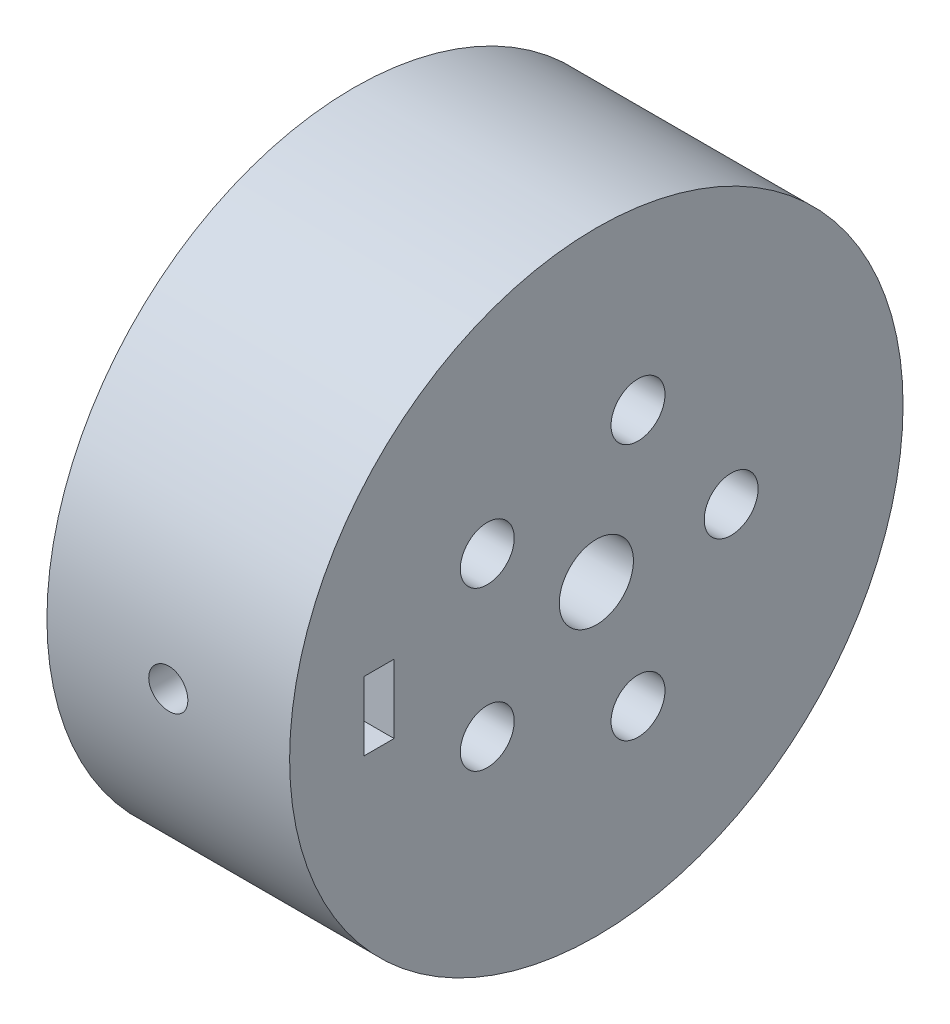
ISO-10303-21;
HEADER;
FILE_DESCRIPTION(('STEP AP214'),'2;1');
FILE_NAME('part.step','',(''),(''),'','','');
FILE_SCHEMA(('AUTOMOTIVE_DESIGN { 1 0 10303 214 1 1 1 1 }'));
ENDSEC;
DATA;
#1=APPLICATION_CONTEXT('core data for automotive mechanical design processes');
#2=APPLICATION_PROTOCOL_DEFINITION('international standard','automotive_design',2000,#1);
#3=PRODUCT_CONTEXT('',#1,'mechanical');
#4=PRODUCT('Part','Part','',(#3));
#5=PRODUCT_RELATED_PRODUCT_CATEGORY('part','',(#4));
#6=PRODUCT_DEFINITION_FORMATION('','',#4);
#7=PRODUCT_DEFINITION_CONTEXT('part definition',#1,'design');
#8=PRODUCT_DEFINITION('design','',#6,#7);
#9=PRODUCT_DEFINITION_SHAPE('','',#8);
#10=(LENGTH_UNIT() NAMED_UNIT(*) SI_UNIT(.MILLI.,.METRE.));
#11=(NAMED_UNIT(*) PLANE_ANGLE_UNIT() SI_UNIT($,.RADIAN.));
#12=(NAMED_UNIT(*) SI_UNIT($,.STERADIAN.) SOLID_ANGLE_UNIT());
#13=UNCERTAINTY_MEASURE_WITH_UNIT(LENGTH_MEASURE(1.E-05),#10,'distance_accuracy_value','');
#14=(GEOMETRIC_REPRESENTATION_CONTEXT(3) GLOBAL_UNCERTAINTY_ASSIGNED_CONTEXT((#13)) GLOBAL_UNIT_ASSIGNED_CONTEXT((#10,
#11,#12)) REPRESENTATION_CONTEXT('',''));
#15=CARTESIAN_POINT('',(0.,0.,0.));
#16=DIRECTION('',(0.,0.,1.));
#17=DIRECTION('',(1.,0.,0.));
#18=AXIS2_PLACEMENT_3D('',#15,#16,#17);
#19=CARTESIAN_POINT('',(0.,0.,0.));
#20=DIRECTION('',(-1.,0.,0.));
#21=DIRECTION('',(0.,0.,1.));
#22=AXIS2_PLACEMENT_3D('',#19,#20,#21);
#23=CYLINDRICAL_SURFACE('',#22,2.75);
#24=CARTESIAN_POINT('',(10.45,0.,2.75));
#25=CARTESIAN_POINT('',(10.449995069663,0.0757217767124656,2.74999562247219));
#26=CARTESIAN_POINT('',(10.4440338958334,0.15151844121742,2.74683982235794));
#27=CARTESIAN_POINT('',(10.4204682053176,0.300839566540251,2.73452609348748));
#28=CARTESIAN_POINT('',(10.4028448908254,0.374360158028599,2.72535847470208));
#29=CARTESIAN_POINT('',(10.3568518761818,0.516748050678436,2.70197293486777));
#30=CARTESIAN_POINT('',(10.3285253759245,0.585632763420143,2.68777532988684));
#31=CARTESIAN_POINT('',(10.2621715494295,0.717551583033452,2.65560473888556));
#32=CARTESIAN_POINT('',(10.2241443203357,0.780585748484359,2.63763179067216));
#33=CARTESIAN_POINT('',(10.1366705393327,0.903627998944102,2.59815283350458));
#34=CARTESIAN_POINT('',(10.0866417910329,0.963172019189273,2.57649299953076));
#35=CARTESIAN_POINT('',(9.97785176255068,1.07345911536568,2.53253172479387));
#36=CARTESIAN_POINT('',(9.91908309966722,1.12419467139108,2.5102297545804));
#37=CARTESIAN_POINT('',(9.78826022218324,1.21995244859455,2.4652093569518));
#38=CARTESIAN_POINT('',(9.71549016145123,1.26406979709183,2.44262919697919));
#39=CARTESIAN_POINT('',(9.56227348782833,1.33925885644004,2.40223198994562));
#40=CARTESIAN_POINT('',(9.48183279875224,1.37034053582565,2.3844113070564));
#41=CARTESIAN_POINT('',(9.320593840749,1.41643919923713,2.3573036009403));
#42=CARTESIAN_POINT('',(9.24012862861637,1.43233469004851,2.34755497140489));
#43=CARTESIAN_POINT('',(9.07713436948377,1.45025862746588,2.33653039636453));
#44=CARTESIAN_POINT('',(8.99460793490149,1.45230381380946,2.3352442230299));
#45=CARTESIAN_POINT('',(8.84199907715631,1.44311047679491,2.34092747162734));
#46=CARTESIAN_POINT('',(8.77175759463369,1.43364946066586,2.34679248623191));
#47=CARTESIAN_POINT('',(8.63406044055441,1.40482685489548,2.36415775926494));
#48=CARTESIAN_POINT('',(8.56660585236846,1.38546145346581,2.37566018722952));
#49=CARTESIAN_POINT('',(8.43448387451829,1.33707063823446,2.40323289600611));
#50=CARTESIAN_POINT('',(8.36991456061906,1.30783584938004,2.41940097296619));
#51=CARTESIAN_POINT('',(8.24627368364701,1.24070589624423,2.45450249039641));
#52=CARTESIAN_POINT('',(8.18720458813159,1.20280687102834,2.47343716234785));
#53=CARTESIAN_POINT('',(8.06734148212841,1.11311415709875,2.51520515735252));
#54=CARTESIAN_POINT('',(8.0075105936019,1.060108150563,2.53820860414688));
#55=CARTESIAN_POINT('',(7.89715983903439,0.944784367134372,2.58335424325173));
#56=CARTESIAN_POINT('',(7.84664541656298,0.882461184516925,2.60549592611432));
#57=CARTESIAN_POINT('',(7.75361830125855,0.745815827956461,2.64795330232689));
#58=CARTESIAN_POINT('',(7.71172564299433,0.671012265476552,2.66809303455083));
#59=CARTESIAN_POINT('',(7.64147968187052,0.514094470645709,2.70270970443248));
#60=CARTESIAN_POINT('',(7.61311453418482,0.431986708961617,2.71719159413818));
#61=CARTESIAN_POINT('',(7.57326628204942,0.270584463861762,2.73775570235597));
#62=CARTESIAN_POINT('',(7.56050948898879,0.191685865680392,2.74446874709147));
#63=CARTESIAN_POINT('',(7.54817642857174,0.0325971858249596,2.75095636179639));
#64=CARTESIAN_POINT('',(7.54859281064471,-0.0475921506551146,2.75073480124412));
#65=CARTESIAN_POINT('',(7.5619394943635,-0.199438696085244,2.74371897468013));
#66=CARTESIAN_POINT('',(7.57376254314599,-0.27122449899868,2.73750629510135));
#67=CARTESIAN_POINT('',(7.60777764659164,-0.411625629730654,2.71993960040525));
#68=CARTESIAN_POINT('',(7.6299707911109,-0.480240623476564,2.70858504490095));
#69=CARTESIAN_POINT('',(7.68456819416235,-0.614429508026686,2.6813779006995));
#70=CARTESIAN_POINT('',(7.7172204526498,-0.679879754431056,2.66541711170771));
#71=CARTESIAN_POINT('',(7.79151113995952,-0.804566851839431,2.63046980915173));
#72=CARTESIAN_POINT('',(7.83315314724154,-0.863801214554366,2.61148209147774));
#73=CARTESIAN_POINT('',(7.92931041415641,-0.981053525663349,2.56988355030503));
#74=CARTESIAN_POINT('',(7.98472251324502,-1.03827641704996,2.54710203996255));
#75=CARTESIAN_POINT('',(8.10426197231554,-1.14301212745053,2.50185629923189));
#76=CARTESIAN_POINT('',(8.16839694905014,-1.19051636840498,2.47939236528712));
#77=CARTESIAN_POINT('',(8.30862021581735,-1.27738733617609,2.43583504781051));
#78=CARTESIAN_POINT('',(8.38520965531786,-1.3160430836391,2.41492007892378));
#79=CARTESIAN_POINT('',(8.54523125168443,-1.37951686001394,2.37923850663947));
#80=CARTESIAN_POINT('',(8.62865360262927,-1.4043543338033,2.36446327094999));
#81=CARTESIAN_POINT('',(8.79129917746192,-1.43705702620182,2.34471757406763));
#82=CARTESIAN_POINT('',(8.87013334992739,-1.44634636648758,2.33892850035797));
#83=CARTESIAN_POINT('',(9.02841591207051,-1.45187856621797,2.33550111528502));
#84=CARTESIAN_POINT('',(9.10786388527185,-1.44812960891938,2.33785769144305));
#85=CARTESIAN_POINT('',(9.25529143404626,-1.42905637820326,2.34955168238111));
#86=CARTESIAN_POINT('',(9.32352884184466,-1.41513141958747,2.35804390065271));
#87=CARTESIAN_POINT('',(9.45658301988802,-1.3779717802415,2.37994876641471));
#88=CARTESIAN_POINT('',(9.52139855185296,-1.35473375515795,2.39336318133616));
#89=CARTESIAN_POINT('',(9.65049020230223,-1.29794357551844,2.42465575849645));
#90=CARTESIAN_POINT('',(9.71445511544404,-1.26381731892805,2.44276808334759));
#91=CARTESIAN_POINT('',(9.83617882028143,-1.18680186877803,2.48109885194062));
#92=CARTESIAN_POINT('',(9.89393424562381,-1.14390795819606,2.5013184265066));
#93=CARTESIAN_POINT('',(10.0100492434324,-1.04354435240618,2.54497750781303));
#94=CARTESIAN_POINT('',(10.0673565790249,-0.984873980121809,2.5684707457662));
#95=CARTESIAN_POINT('',(10.1716163007138,-0.858221362602379,2.61351724838136));
#96=CARTESIAN_POINT('',(10.2185622219712,-0.790233346407056,2.63506929693401));
#97=CARTESIAN_POINT('',(10.3014754256576,-0.644832205291341,2.67441176535958));
#98=CARTESIAN_POINT('',(10.3371949426401,-0.567252912481021,2.6921149435846));
#99=CARTESIAN_POINT('',(10.394595815003,-0.406050458607909,2.72108011882091));
#100=CARTESIAN_POINT('',(10.4163151450917,-0.322444336601421,2.73235953015806));
#101=CARTESIAN_POINT('',(10.4369367272562,-0.198230482722232,2.74313020404769));
#102=CARTESIAN_POINT('',(10.441826677779,-0.158795410597046,2.74569788798007));
#103=CARTESIAN_POINT('',(10.4483596387976,-0.0795804595371075,2.74913395153816));
#104=CARTESIAN_POINT('',(10.4500025914638,-0.0398005744738614,2.75000230089849));
#105=CARTESIAN_POINT('',(10.45,0.,2.75));
#106=B_SPLINE_CURVE_WITH_KNOTS('',3,(#24,#25,#26,#27,#28,#29,#30,#31,#32,#33,#34,#35,#36,#37,
#38,#39,#40,#41,#42,#43,#44,#45,#46,#47,#48,#49,#50,#51,#52,#53,#54,#55,#56,#57,#58,#59,#60,#61,
#62,#63,#64,#65,#66,#67,#68,#69,#70,#71,#72,#73,#74,#75,#76,#77,#78,#79,#80,#81,#82,#83,#84,#85,
#86,#87,#88,#89,#90,#91,#92,#93,#94,#95,#96,#97,#98,#99,#100,#101,#102,#103,#104,#105),
.UNSPECIFIED.,.T.,.F.,(4,2,2,2,2,2,2,2,2,2,2,2,2,2,2,2,2,2,2,2,2,2,2,2,2,2,2,2,2,2,2,2,2,2,2,2,
2,2,2,2,4),(0.,0.227004590824905,0.454375976763216,0.680839289377896,0.907300334256857,
1.14850253156475,1.38990964459944,1.65271198017666,1.91531297955212,2.16159025411002,
2.40756982013213,2.61992702827455,2.83236602549302,3.04962911949956,3.26698921909138,
3.51545875158986,3.76407300694324,4.02685492536497,4.28940632487058,4.52868227392265,
4.76782471046114,4.98586935010272,5.20393691053074,5.42761440152073,5.65138109429743,
5.89887614896958,6.14658871882607,6.4100781740178,6.67319590667478,6.91054158266204,
7.14773831972574,7.35730337675769,7.56694375683198,7.79026439332691,8.0137054946867,
8.26849732625694,8.52344768451001,8.78368324370711,9.04320992497645,9.16252503624992,
9.28184227252321),.UNSPECIFIED.);
#107=CARTESIAN_POINT('',(10.45,0.,2.75));
#108=VERTEX_POINT('',#107);
#109=EDGE_CURVE('E272',#108,#108,#106,.T.);
#110=ORIENTED_EDGE('',*,*,#109,.T.);
#111=EDGE_LOOP('',(#110));
#112=FACE_BOUND('',#111,.T.);
#113=CARTESIAN_POINT('',(18.,0.,0.));
#114=DIRECTION('',(-1.,0.,0.));
#115=DIRECTION('',(0.,0.,1.));
#116=AXIS2_PLACEMENT_3D('',#113,#114,#115);
#117=CIRCLE('',#116,2.75);
#118=CARTESIAN_POINT('',(18.,0.,2.75));
#119=VERTEX_POINT('',#118);
#120=EDGE_CURVE('E58',#119,#119,#117,.T.);
#121=ORIENTED_EDGE('',*,*,#120,.F.);
#122=EDGE_LOOP('',(#121));
#123=FACE_BOUND('',#122,.T.);
#124=CARTESIAN_POINT('',(0.,0.,0.));
#125=DIRECTION('',(-1.,0.,0.));
#126=DIRECTION('',(0.,0.,1.));
#127=AXIS2_PLACEMENT_3D('',#124,#125,#126);
#128=CIRCLE('',#127,2.75);
#129=CARTESIAN_POINT('',(0.,0.,2.75));
#130=VERTEX_POINT('',#129);
#131=EDGE_CURVE('E174',#130,#130,#128,.T.);
#132=ORIENTED_EDGE('',*,*,#131,.T.);
#133=EDGE_LOOP('',(#132));
#134=FACE_BOUND('',#133,.T.);
#135=ADVANCED_FACE('F45',(#112,#123,#134),#23,.F.);
#136=CARTESIAN_POINT('',(18.,2.75,0.));
#137=DIRECTION('',(-1.,0.,0.));
#138=DIRECTION('',(0.,0.,1.));
#139=AXIS2_PLACEMENT_3D('',#136,#137,#138);
#140=PLANE('',#139);
#141=DIRECTION('',(0.,0.,-1.));
#142=VECTOR('',#141,1.);
#143=CARTESIAN_POINT('',(18.,-2.55,15.));
#144=LINE('',#143,#142);
#145=CARTESIAN_POINT('',(18.,-2.55,17.25));
#146=VERTEX_POINT('',#145);
#147=CARTESIAN_POINT('',(18.,-2.55,15.));
#148=VERTEX_POINT('',#147);
#149=EDGE_CURVE('E135',#146,#148,#144,.T.);
#150=ORIENTED_EDGE('',*,*,#149,.F.);
#151=DIRECTION('',(0.,-1.,0.));
#152=VECTOR('',#151,1.);
#153=CARTESIAN_POINT('',(18.,-2.55,17.25));
#154=LINE('',#153,#152);
#155=CARTESIAN_POINT('',(18.,2.55,17.25));
#156=VERTEX_POINT('',#155);
#157=EDGE_CURVE('E65',#156,#146,#154,.T.);
#158=ORIENTED_EDGE('',*,*,#157,.F.);
#159=DIRECTION('',(0.,0.,1.));
#160=VECTOR('',#159,1.);
#161=CARTESIAN_POINT('',(18.,2.55,15.));
#162=LINE('',#161,#160);
#163=CARTESIAN_POINT('',(18.,2.55,15.));
#164=VERTEX_POINT('',#163);
#165=EDGE_CURVE('E123',#164,#156,#162,.T.);
#166=ORIENTED_EDGE('',*,*,#165,.F.);
#167=DIRECTION('',(0.,1.,0.));
#168=VECTOR('',#167,1.);
#169=CARTESIAN_POINT('',(18.,-2.55,15.));
#170=LINE('',#169,#168);
#171=EDGE_CURVE('E126',#148,#164,#170,.T.);
#172=ORIENTED_EDGE('',*,*,#171,.F.);
#173=EDGE_LOOP('',(#150,#158,#166,#172));
#174=FACE_BOUND('',#173,.T.);
#175=CARTESIAN_POINT('',(18.,0.,-10.));
#176=DIRECTION('',(1.,0.,0.));
#177=DIRECTION('',(0.,0.,-1.));
#178=AXIS2_PLACEMENT_3D('',#175,#176,#177);
#179=CIRCLE('',#178,2.);
#180=CARTESIAN_POINT('',(18.,0.,-12.));
#181=VERTEX_POINT('',#180);
#182=EDGE_CURVE('E141',#181,#181,#179,.T.);
#183=ORIENTED_EDGE('',*,*,#182,.F.);
#184=EDGE_LOOP('',(#183));
#185=FACE_BOUND('',#184,.T.);
#186=CARTESIAN_POINT('',(18.,9.51056516295154,-3.09016994374948));
#187=DIRECTION('',(1.,0.,0.));
#188=DIRECTION('',(0.,0.,-1.));
#189=AXIS2_PLACEMENT_3D('',#186,#187,#188);
#190=CIRCLE('',#189,2.);
#191=CARTESIAN_POINT('',(18.,9.51056516295154,-5.09016994374947));
#192=VERTEX_POINT('',#191);
#193=EDGE_CURVE('E150',#192,#192,#190,.T.);
#194=ORIENTED_EDGE('',*,*,#193,.F.);
#195=EDGE_LOOP('',(#194));
#196=FACE_BOUND('',#195,.T.);
#197=CARTESIAN_POINT('',(18.,5.87785252292474,8.09016994374948));
#198=DIRECTION('',(1.,0.,0.));
#199=DIRECTION('',(0.,0.,-1.));
#200=AXIS2_PLACEMENT_3D('',#197,#198,#199);
#201=CIRCLE('',#200,2.);
#202=CARTESIAN_POINT('',(18.,5.87785252292474,6.09016994374948));
#203=VERTEX_POINT('',#202);
#204=EDGE_CURVE('E156',#203,#203,#201,.T.);
#205=ORIENTED_EDGE('',*,*,#204,.F.);
#206=EDGE_LOOP('',(#205));
#207=FACE_BOUND('',#206,.T.);
#208=CARTESIAN_POINT('',(18.,-5.87785252292473,8.09016994374948));
#209=DIRECTION('',(1.,0.,0.));
#210=DIRECTION('',(0.,0.,-1.));
#211=AXIS2_PLACEMENT_3D('',#208,#209,#210);
#212=CIRCLE('',#211,2.);
#213=CARTESIAN_POINT('',(18.,-5.87785252292473,6.09016994374948));
#214=VERTEX_POINT('',#213);
#215=EDGE_CURVE('E162',#214,#214,#212,.T.);
#216=ORIENTED_EDGE('',*,*,#215,.F.);
#217=EDGE_LOOP('',(#216));
#218=FACE_BOUND('',#217,.T.);
#219=CARTESIAN_POINT('',(18.,-9.51056516295154,-3.09016994374947));
#220=DIRECTION('',(1.,0.,0.));
#221=DIRECTION('',(0.,0.,-1.));
#222=AXIS2_PLACEMENT_3D('',#219,#220,#221);
#223=CIRCLE('',#222,2.);
#224=CARTESIAN_POINT('',(18.,-9.51056516295154,-5.09016994374947));
#225=VERTEX_POINT('',#224);
#226=EDGE_CURVE('E168',#225,#225,#223,.T.);
#227=ORIENTED_EDGE('',*,*,#226,.F.);
#228=EDGE_LOOP('',(#227));
#229=FACE_BOUND('',#228,.T.);
#230=CARTESIAN_POINT('',(18.,0.,0.));
#231=DIRECTION('',(-1.,0.,0.));
#232=DIRECTION('',(0.,0.,1.));
#233=AXIS2_PLACEMENT_3D('',#230,#231,#232);
#234=CIRCLE('',#233,22.75);
#235=CARTESIAN_POINT('',(18.,0.,22.75));
#236=VERTEX_POINT('',#235);
#237=EDGE_CURVE('E180',#236,#236,#234,.T.);
#238=ORIENTED_EDGE('',*,*,#237,.F.);
#239=EDGE_LOOP('',(#238));
#240=FACE_BOUND('',#239,.T.);
#241=ORIENTED_EDGE('',*,*,#120,.T.);
#242=EDGE_LOOP('',(#241));
#243=FACE_BOUND('',#242,.T.);
#244=ADVANCED_FACE('F185',(#174,#185,#196,#207,#218,#229,#240,#243),#140,.F.);
#245=CARTESIAN_POINT('',(0.,0.,0.));
#246=DIRECTION('',(-1.,0.,0.));
#247=DIRECTION('',(0.,0.,1.));
#248=AXIS2_PLACEMENT_3D('',#245,#246,#247);
#249=CYLINDRICAL_SURFACE('',#248,22.75);
#250=CARTESIAN_POINT('',(7.55000000000001,0.,22.75));
#251=CARTESIAN_POINT('',(7.55000357851993,0.0813585275417845,22.7499993861578));
#252=CARTESIAN_POINT('',(7.55687046929861,0.162773940674775,22.7495589019466));
#253=CARTESIAN_POINT('',(7.58416516410755,0.323356469671769,22.7478440708388));
#254=CARTESIAN_POINT('',(7.60460873025185,0.40252086063531,22.7465687547521));
#255=CARTESIAN_POINT('',(7.65846699785905,0.556252071186776,22.7433285243789));
#256=CARTESIAN_POINT('',(7.69187483136951,0.630821300910533,22.7413639752735));
#257=CARTESIAN_POINT('',(7.77070211276974,0.773274221263976,22.7369662025309));
#258=CARTESIAN_POINT('',(7.81611881914667,0.841159432944067,22.7345330858977));
#259=CARTESIAN_POINT('',(7.91775178394438,0.96844206126281,22.7294674250519));
#260=CARTESIAN_POINT('',(7.97398273903644,1.02782773315501,22.7268346124335));
#261=CARTESIAN_POINT('',(8.09561766536436,1.13632508061146,22.7216685819199));
#262=CARTESIAN_POINT('',(8.161022020692,1.18543632576911,22.7191353682006));
#263=CARTESIAN_POINT('',(8.29921400878078,1.27202718758771,22.7144521315116));
#264=CARTESIAN_POINT('',(8.37200779356298,1.30949700511995,22.712302432008));
#265=CARTESIAN_POINT('',(8.52286917789692,1.37167868695877,22.7086321347308));
#266=CARTESIAN_POINT('',(8.60093671886126,1.39639069296855,22.7071115299697));
#267=CARTESIAN_POINT('',(8.76001606302171,1.43232255965349,22.7048734665655));
#268=CARTESIAN_POINT('',(8.84102368179251,1.44356087629775,22.7041549093883));
#269=CARTESIAN_POINT('',(9.0037785070252,1.45228332521019,22.703598683715));
#270=CARTESIAN_POINT('',(9.08552570481747,1.44976761850019,22.7037610049063));
#271=CARTESIAN_POINT('',(9.2473133893915,1.43106874463453,22.7049472111941));
#272=CARTESIAN_POINT('',(9.32735619550781,1.41490555399786,22.7059698370107));
#273=CARTESIAN_POINT('',(9.48359025996693,1.36940151354232,22.7087594274374));
#274=CARTESIAN_POINT('',(9.55978149447698,1.34006058219332,22.7105263966527));
#275=CARTESIAN_POINT('',(9.70621377475411,1.26901127997108,22.7146069989626));
#276=CARTESIAN_POINT('',(9.77645041454656,1.22729385231266,22.716921032131));
#277=CARTESIAN_POINT('',(9.90893157395181,1.13268232401818,22.7218345896205));
#278=CARTESIAN_POINT('',(9.97117599999398,1.07978809254637,22.7244341172834));
#279=CARTESIAN_POINT('',(10.0860220645333,0.964211942681767,22.7296313096726));
#280=CARTESIAN_POINT('',(10.1386063076321,0.901512736690292,22.7322289628081));
#281=CARTESIAN_POINT('',(10.2325051367252,0.768167028545454,22.7371252165152));
#282=CARTESIAN_POINT('',(10.2738197186336,0.697520523510667,22.7394238169784));
#283=CARTESIAN_POINT('',(10.3440050025784,0.550275024252854,22.7434631436173));
#284=CARTESIAN_POINT('',(10.3728750400373,0.473675712389107,22.745203839998));
#285=CARTESIAN_POINT('',(10.4173400711175,0.31670371136105,22.7479308109293));
#286=CARTESIAN_POINT('',(10.4329352259541,0.236331068034068,22.7489170946417));
#287=CARTESIAN_POINT('',(10.4503862344524,0.0742448103542507,22.7500229221251));
#288=CARTESIAN_POINT('',(10.4522661376292,-0.00746620481477161,22.7501439830453));
#289=CARTESIAN_POINT('',(10.4422961252679,-0.170042404025864,22.7495097595252));
#290=CARTESIAN_POINT('',(10.4304462840756,-0.250907592645644,22.7487544798302));
#291=CARTESIAN_POINT('',(10.3933730706137,-0.409428879446593,22.7464535726857));
#292=CARTESIAN_POINT('',(10.3681607380877,-0.487087569747515,22.7449085976994));
#293=CARTESIAN_POINT('',(10.3050894437382,-0.637071433850495,22.7412021014603));
#294=CARTESIAN_POINT('',(10.267230363665,-0.709396557774891,22.7390405744427));
#295=CARTESIAN_POINT('',(10.1798790744588,-0.846770338985919,22.7343400412353));
#296=CARTESIAN_POINT('',(10.1303708099313,-0.911808769166961,22.7318005158633));
#297=CARTESIAN_POINT('',(10.0211498705537,-1.03265999156122,22.7266314989228));
#298=CARTESIAN_POINT('',(9.96143709132533,-1.08847268939619,22.7240020064342));
#299=CARTESIAN_POINT('',(9.83339836056565,-1.1893696480122,22.7189450185297));
#300=CARTESIAN_POINT('',(9.76506009706097,-1.23443830176336,22.7165178202571));
#301=CARTESIAN_POINT('',(9.62177212176966,-1.31246106743336,22.7121438770768));
#302=CARTESIAN_POINT('',(9.54682245207634,-1.34541525647532,22.7101971291106));
#303=CARTESIAN_POINT('',(9.39249612689346,-1.39824664161911,22.707005772233));
#304=CARTESIAN_POINT('',(9.31312284077834,-1.41813364694836,22.705760636738));
#305=CARTESIAN_POINT('',(9.15215562760652,-1.44429817701894,22.7041114624452));
#306=CARTESIAN_POINT('',(9.07056172364933,-1.45057584327376,22.7037074149016));
#307=CARTESIAN_POINT('',(8.90762460892918,-1.44934211843042,22.7037861937129));
#308=CARTESIAN_POINT('',(8.82628121048671,-1.4418552630988,22.7042674419962));
#309=CARTESIAN_POINT('',(8.66600903673088,-1.41335590368549,22.7060592382015));
#310=CARTESIAN_POINT('',(8.58708026576386,-1.3923433752591,22.7073697876162));
#311=CARTESIAN_POINT('',(8.4338742577084,-1.33739469915179,22.7106721125495));
#312=CARTESIAN_POINT('',(8.35959697803811,-1.30345866979856,22.7126638818307));
#313=CARTESIAN_POINT('',(8.21779110832447,-1.22362964349398,22.7171041636706));
#314=CARTESIAN_POINT('',(8.15026234709828,-1.17773694994181,22.7195526646391));
#315=CARTESIAN_POINT('',(8.02374589707366,-1.07520648632035,22.7246355870574));
#316=CARTESIAN_POINT('',(7.96477262287434,-1.01855094505899,22.7272703114089));
#317=CARTESIAN_POINT('',(7.85715338121946,-0.896127531409731,22.7324261936047));
#318=CARTESIAN_POINT('',(7.80850994254327,-0.830357434244234,22.734947323522));
#319=CARTESIAN_POINT('',(7.7228938844778,-0.691494382644425,22.7395946428017));
#320=CARTESIAN_POINT('',(7.68593614873235,-0.618392244426833,22.7417203270933));
#321=CARTESIAN_POINT('',(7.62486438053092,-0.467059842278153,22.7453305096491));
#322=CARTESIAN_POINT('',(7.60073532017594,-0.388835699658379,22.7468157577524));
#323=CARTESIAN_POINT('',(7.57227069292151,-0.258444873499764,22.7485889072317));
#324=CARTESIAN_POINT('',(7.56392999765054,-0.207120820371272,22.749115712388));
#325=CARTESIAN_POINT('',(7.55279351274304,-0.103872241420784,22.7498214544913));
#326=CARTESIAN_POINT('',(7.54999771510199,-0.0519477164657268,22.7500003919405));
#327=CARTESIAN_POINT('',(7.55000000000001,0.,22.75));
#328=B_SPLINE_CURVE_WITH_KNOTS('',3,(#250,#251,#252,#253,#254,#255,#256,#257,#258,#259,#260,
#261,#262,#263,#264,#265,#266,#267,#268,#269,#270,#271,#272,#273,#274,#275,#276,#277,#278,#279,
#280,#281,#282,#283,#284,#285,#286,#287,#288,#289,#290,#291,#292,#293,#294,#295,#296,#297,#298,
#299,#300,#301,#302,#303,#304,#305,#306,#307,#308,#309,#310,#311,#312,#313,#314,#315,#316,#317,
#318,#319,#320,#321,#322,#323,#324,#325,#326,#327),.UNSPECIFIED.,.T.,.F.,(4,2,2,2,2,2,2,2,2,2,2,
2,2,2,2,2,2,2,2,2,2,2,2,2,2,2,2,2,2,2,2,2,2,2,2,2,2,2,4),(0.,0.24388594130455,0.488055523036957,
0.732095929647417,0.976080672154712,1.22039936584253,1.46472829224996,1.70926232788804,
1.95379364738631,2.19798962905983,2.44218275187564,2.68601905515585,2.92985686706181,
3.17387355486345,3.41789309928453,3.66234784007737,3.90680266950157,4.15127055196049,
4.39573546546304,4.63977160966396,4.8838064324293,5.12763995352118,5.37147575457043,
5.61564960943614,5.85982596201916,6.1043548781167,6.34888223746715,6.59322582553151,
6.83756687283464,7.08147279544854,7.32537915706682,7.56928328553008,7.81318122555278,
8.05748543673563,8.30184938566361,8.54652332969074,8.79091002019173,8.94663230771218,
9.1023543704346),.UNSPECIFIED.);
#329=CARTESIAN_POINT('',(7.55000000000001,0.,22.75));
#330=VERTEX_POINT('',#329);
#331=EDGE_CURVE('E11',#330,#330,#328,.T.);
#332=ORIENTED_EDGE('',*,*,#331,.T.);
#333=EDGE_LOOP('',(#332));
#334=FACE_BOUND('',#333,.T.);
#335=CARTESIAN_POINT('',(0.,0.,0.));
#336=DIRECTION('',(-1.,0.,0.));
#337=DIRECTION('',(0.,0.,1.));
#338=AXIS2_PLACEMENT_3D('',#335,#336,#337);
#339=CIRCLE('',#338,22.75);
#340=CARTESIAN_POINT('',(0.,0.,22.75));
#341=VERTEX_POINT('',#340);
#342=EDGE_CURVE('E177',#341,#341,#339,.T.);
#343=ORIENTED_EDGE('',*,*,#342,.F.);
#344=EDGE_LOOP('',(#343));
#345=FACE_BOUND('',#344,.T.);
#346=ORIENTED_EDGE('',*,*,#237,.T.);
#347=EDGE_LOOP('',(#346));
#348=FACE_BOUND('',#347,.T.);
#349=ADVANCED_FACE('F196',(#334,#345,#348),#249,.T.);
#350=CARTESIAN_POINT('',(0.,22.75,0.));
#351=DIRECTION('',(1.,0.,0.));
#352=DIRECTION('',(0.,0.,-1.));
#353=AXIS2_PLACEMENT_3D('',#350,#351,#352);
#354=PLANE('',#353);
#355=ORIENTED_EDGE('',*,*,#131,.F.);
#356=EDGE_LOOP('',(#355));
#357=FACE_BOUND('',#356,.T.);
#358=ORIENTED_EDGE('',*,*,#342,.T.);
#359=EDGE_LOOP('',(#358));
#360=FACE_BOUND('',#359,.T.);
#361=ADVANCED_FACE('F192',(#357,#360),#354,.F.);
#362=CARTESIAN_POINT('',(9.5,-9.51056516295154,-3.09016994374947));
#363=DIRECTION('',(1.,0.,0.));
#364=DIRECTION('',(0.,0.,-1.));
#365=AXIS2_PLACEMENT_3D('',#362,#363,#364);
#366=CONICAL_SURFACE('',#365,2.,1.02974425867665);
#367=CARTESIAN_POINT('',(8.29827876194488,-9.51056516295154,-3.09016994374947));
#368=VERTEX_POINT('',#367);
#369=VERTEX_LOOP('',#368);
#370=FACE_BOUND('',#369,.T.);
#371=CARTESIAN_POINT('',(9.5,-9.51056516295154,-3.09016994374947));
#372=DIRECTION('',(1.,0.,0.));
#373=DIRECTION('',(0.,0.,-1.));
#374=AXIS2_PLACEMENT_3D('',#371,#372,#373);
#375=CIRCLE('',#374,2.);
#376=CARTESIAN_POINT('',(9.5,-9.51056516295154,-5.09016994374947));
#377=VERTEX_POINT('',#376);
#378=EDGE_CURVE('E171',#377,#377,#375,.T.);
#379=ORIENTED_EDGE('',*,*,#378,.T.);
#380=EDGE_LOOP('',(#379));
#381=FACE_BOUND('',#380,.T.);
#382=ADVANCED_FACE('F195',(#370,#381),#366,.F.);
#383=CARTESIAN_POINT('',(18.,-9.51056516295154,-3.09016994374947));
#384=DIRECTION('',(1.,0.,0.));
#385=DIRECTION('',(0.,0.,-1.));
#386=AXIS2_PLACEMENT_3D('',#383,#384,#385);
#387=CYLINDRICAL_SURFACE('',#386,2.);
#388=ORIENTED_EDGE('',*,*,#378,.F.);
#389=EDGE_LOOP('',(#388));
#390=FACE_BOUND('',#389,.T.);
#391=ORIENTED_EDGE('',*,*,#226,.T.);
#392=EDGE_LOOP('',(#391));
#393=FACE_BOUND('',#392,.T.);
#394=ADVANCED_FACE('F216',(#390,#393),#387,.F.);
#395=CARTESIAN_POINT('',(9.5,-5.87785252292473,8.09016994374948));
#396=DIRECTION('',(1.,0.,0.));
#397=DIRECTION('',(0.,0.,-1.));
#398=AXIS2_PLACEMENT_3D('',#395,#396,#397);
#399=CONICAL_SURFACE('',#398,2.,1.02974425867665);
#400=CARTESIAN_POINT('',(8.29827876194488,-5.87785252292473,8.09016994374948));
#401=VERTEX_POINT('',#400);
#402=VERTEX_LOOP('',#401);
#403=FACE_BOUND('',#402,.T.);
#404=CARTESIAN_POINT('',(9.5,-5.87785252292473,8.09016994374948));
#405=DIRECTION('',(1.,0.,0.));
#406=DIRECTION('',(0.,0.,-1.));
#407=AXIS2_PLACEMENT_3D('',#404,#405,#406);
#408=CIRCLE('',#407,2.);
#409=CARTESIAN_POINT('',(9.5,-5.87785252292473,6.09016994374948));
#410=VERTEX_POINT('',#409);
#411=EDGE_CURVE('E165',#410,#410,#408,.T.);
#412=ORIENTED_EDGE('',*,*,#411,.T.);
#413=EDGE_LOOP('',(#412));
#414=FACE_BOUND('',#413,.T.);
#415=ADVANCED_FACE('F219',(#403,#414),#399,.F.);
#416=CARTESIAN_POINT('',(18.,-5.87785252292473,8.09016994374948));
#417=DIRECTION('',(1.,0.,0.));
#418=DIRECTION('',(0.,0.,-1.));
#419=AXIS2_PLACEMENT_3D('',#416,#417,#418);
#420=CYLINDRICAL_SURFACE('',#419,2.);
#421=ORIENTED_EDGE('',*,*,#411,.F.);
#422=EDGE_LOOP('',(#421));
#423=FACE_BOUND('',#422,.T.);
#424=ORIENTED_EDGE('',*,*,#215,.T.);
#425=EDGE_LOOP('',(#424));
#426=FACE_BOUND('',#425,.T.);
#427=ADVANCED_FACE('F223',(#423,#426),#420,.F.);
#428=CARTESIAN_POINT('',(9.5,5.87785252292474,8.09016994374948));
#429=DIRECTION('',(1.,0.,0.));
#430=DIRECTION('',(0.,0.,-1.));
#431=AXIS2_PLACEMENT_3D('',#428,#429,#430);
#432=CONICAL_SURFACE('',#431,2.,1.02974425867665);
#433=CARTESIAN_POINT('',(8.29827876194488,5.87785252292473,8.09016994374948));
#434=VERTEX_POINT('',#433);
#435=VERTEX_LOOP('',#434);
#436=FACE_BOUND('',#435,.T.);
#437=CARTESIAN_POINT('',(9.5,5.87785252292474,8.09016994374948));
#438=DIRECTION('',(1.,0.,0.));
#439=DIRECTION('',(0.,0.,-1.));
#440=AXIS2_PLACEMENT_3D('',#437,#438,#439);
#441=CIRCLE('',#440,2.);
#442=CARTESIAN_POINT('',(9.5,5.87785252292474,6.09016994374948));
#443=VERTEX_POINT('',#442);
#444=EDGE_CURVE('E159',#443,#443,#441,.T.);
#445=ORIENTED_EDGE('',*,*,#444,.T.);
#446=EDGE_LOOP('',(#445));
#447=FACE_BOUND('',#446,.T.);
#448=ADVANCED_FACE('F227',(#436,#447),#432,.F.);
#449=CARTESIAN_POINT('',(18.,5.87785252292474,8.09016994374948));
#450=DIRECTION('',(1.,0.,0.));
#451=DIRECTION('',(0.,0.,-1.));
#452=AXIS2_PLACEMENT_3D('',#449,#450,#451);
#453=CYLINDRICAL_SURFACE('',#452,2.);
#454=ORIENTED_EDGE('',*,*,#444,.F.);
#455=EDGE_LOOP('',(#454));
#456=FACE_BOUND('',#455,.T.);
#457=ORIENTED_EDGE('',*,*,#204,.T.);
#458=EDGE_LOOP('',(#457));
#459=FACE_BOUND('',#458,.T.);
#460=ADVANCED_FACE('F231',(#456,#459),#453,.F.);
#461=CARTESIAN_POINT('',(9.5,9.51056516295154,-3.09016994374948));
#462=DIRECTION('',(1.,0.,0.));
#463=DIRECTION('',(0.,0.,-1.));
#464=AXIS2_PLACEMENT_3D('',#461,#462,#463);
#465=CONICAL_SURFACE('',#464,2.,1.02974425867665);
#466=CARTESIAN_POINT('',(8.29827876194488,9.51056516295154,-3.09016994374948));
#467=VERTEX_POINT('',#466);
#468=VERTEX_LOOP('',#467);
#469=FACE_BOUND('',#468,.T.);
#470=CARTESIAN_POINT('',(9.5,9.51056516295154,-3.09016994374948));
#471=DIRECTION('',(1.,0.,0.));
#472=DIRECTION('',(0.,0.,-1.));
#473=AXIS2_PLACEMENT_3D('',#470,#471,#472);
#474=CIRCLE('',#473,2.);
#475=CARTESIAN_POINT('',(9.5,9.51056516295154,-5.09016994374947));
#476=VERTEX_POINT('',#475);
#477=EDGE_CURVE('E153',#476,#476,#474,.T.);
#478=ORIENTED_EDGE('',*,*,#477,.T.);
#479=EDGE_LOOP('',(#478));
#480=FACE_BOUND('',#479,.T.);
#481=ADVANCED_FACE('F235',(#469,#480),#465,.F.);
#482=CARTESIAN_POINT('',(18.,9.51056516295154,-3.09016994374948));
#483=DIRECTION('',(1.,0.,0.));
#484=DIRECTION('',(0.,0.,-1.));
#485=AXIS2_PLACEMENT_3D('',#482,#483,#484);
#486=CYLINDRICAL_SURFACE('',#485,2.);
#487=ORIENTED_EDGE('',*,*,#477,.F.);
#488=EDGE_LOOP('',(#487));
#489=FACE_BOUND('',#488,.T.);
#490=ORIENTED_EDGE('',*,*,#193,.T.);
#491=EDGE_LOOP('',(#490));
#492=FACE_BOUND('',#491,.T.);
#493=ADVANCED_FACE('F239',(#489,#492),#486,.F.);
#494=CARTESIAN_POINT('',(9.5,0.,-10.));
#495=DIRECTION('',(1.,0.,0.));
#496=DIRECTION('',(0.,0.,-1.));
#497=AXIS2_PLACEMENT_3D('',#494,#495,#496);
#498=CONICAL_SURFACE('',#497,2.,1.02974425867665);
#499=CARTESIAN_POINT('',(8.29827876194488,0.,-10.));
#500=VERTEX_POINT('',#499);
#501=VERTEX_LOOP('',#500);
#502=FACE_BOUND('',#501,.T.);
#503=CARTESIAN_POINT('',(9.5,0.,-10.));
#504=DIRECTION('',(1.,0.,0.));
#505=DIRECTION('',(0.,0.,-1.));
#506=AXIS2_PLACEMENT_3D('',#503,#504,#505);
#507=CIRCLE('',#506,2.);
#508=CARTESIAN_POINT('',(9.5,0.,-12.));
#509=VERTEX_POINT('',#508);
#510=EDGE_CURVE('E147',#509,#509,#507,.T.);
#511=ORIENTED_EDGE('',*,*,#510,.T.);
#512=EDGE_LOOP('',(#511));
#513=FACE_BOUND('',#512,.T.);
#514=ADVANCED_FACE('F243',(#502,#513),#498,.F.);
#515=CARTESIAN_POINT('',(18.,0.,-10.));
#516=DIRECTION('',(1.,0.,0.));
#517=DIRECTION('',(0.,0.,-1.));
#518=AXIS2_PLACEMENT_3D('',#515,#516,#517);
#519=CYLINDRICAL_SURFACE('',#518,2.);
#520=ORIENTED_EDGE('',*,*,#510,.F.);
#521=EDGE_LOOP('',(#520));
#522=FACE_BOUND('',#521,.T.);
#523=ORIENTED_EDGE('',*,*,#182,.T.);
#524=EDGE_LOOP('',(#523));
#525=FACE_BOUND('',#524,.T.);
#526=ADVANCED_FACE('F247',(#522,#525),#519,.F.);
#527=CARTESIAN_POINT('',(3.,-2.55,17.25));
#528=DIRECTION('',(0.,0.,1.));
#529=DIRECTION('',(1.,0.,0.));
#530=AXIS2_PLACEMENT_3D('',#527,#528,#529);
#531=PLANE('',#530);
#532=CARTESIAN_POINT('',(9.,0.,17.25));
#533=DIRECTION('',(0.,0.,1.));
#534=DIRECTION('',(1.,0.,0.));
#535=AXIS2_PLACEMENT_3D('',#532,#533,#534);
#536=CIRCLE('',#535,1.44999999999999);
#537=CARTESIAN_POINT('',(10.45,0.,17.25));
#538=VERTEX_POINT('',#537);
#539=EDGE_CURVE('E277',#538,#538,#536,.T.);
#540=ORIENTED_EDGE('',*,*,#539,.T.);
#541=EDGE_LOOP('',(#540));
#542=FACE_BOUND('',#541,.T.);
#543=ORIENTED_EDGE('',*,*,#157,.T.);
#544=DIRECTION('',(1.,0.,0.));
#545=VECTOR('',#544,1.);
#546=CARTESIAN_POINT('',(3.,-2.55,17.25));
#547=LINE('',#546,#545);
#548=CARTESIAN_POINT('',(3.,-2.55,17.25));
#549=VERTEX_POINT('',#548);
#550=EDGE_CURVE('E101',#549,#146,#547,.T.);
#551=ORIENTED_EDGE('',*,*,#550,.F.);
#552=DIRECTION('',(0.,-1.,0.));
#553=VECTOR('',#552,1.);
#554=CARTESIAN_POINT('',(3.,-2.55,17.25));
#555=LINE('',#554,#553);
#556=CARTESIAN_POINT('',(3.,2.55,17.25));
#557=VERTEX_POINT('',#556);
#558=EDGE_CURVE('E105',#557,#549,#555,.T.);
#559=ORIENTED_EDGE('',*,*,#558,.F.);
#560=DIRECTION('',(1.,0.,0.));
#561=VECTOR('',#560,1.);
#562=CARTESIAN_POINT('',(3.,2.55,17.25));
#563=LINE('',#562,#561);
#564=EDGE_CURVE('E139',#557,#156,#563,.T.);
#565=ORIENTED_EDGE('',*,*,#564,.T.);
#566=EDGE_LOOP('',(#543,#551,#559,#565));
#567=FACE_BOUND('',#566,.T.);
#568=ADVANCED_FACE('F103',(#542,#567),#531,.F.);
#569=CARTESIAN_POINT('',(3.,2.55,15.));
#570=DIRECTION('',(0.,1.,0.));
#571=DIRECTION('',(0.,0.,1.));
#572=AXIS2_PLACEMENT_3D('',#569,#570,#571);
#573=PLANE('',#572);
#574=ORIENTED_EDGE('',*,*,#165,.T.);
#575=ORIENTED_EDGE('',*,*,#564,.F.);
#576=DIRECTION('',(0.,0.,1.));
#577=VECTOR('',#576,1.);
#578=CARTESIAN_POINT('',(3.,2.55,15.));
#579=LINE('',#578,#577);
#580=CARTESIAN_POINT('',(3.,2.55,15.));
#581=VERTEX_POINT('',#580);
#582=EDGE_CURVE('E111',#581,#557,#579,.T.);
#583=ORIENTED_EDGE('',*,*,#582,.F.);
#584=DIRECTION('',(1.,0.,0.));
#585=VECTOR('',#584,1.);
#586=CARTESIAN_POINT('',(3.,2.55,15.));
#587=LINE('',#586,#585);
#588=EDGE_CURVE('E142',#581,#164,#587,.T.);
#589=ORIENTED_EDGE('',*,*,#588,.T.);
#590=EDGE_LOOP('',(#574,#575,#583,#589));
#591=FACE_BOUND('',#590,.T.);
#592=ADVANCED_FACE('F254',(#591),#573,.F.);
#593=CARTESIAN_POINT('',(3.,-2.55,15.));
#594=DIRECTION('',(0.,0.,-1.));
#595=DIRECTION('',(-1.,0.,0.));
#596=AXIS2_PLACEMENT_3D('',#593,#594,#595);
#597=PLANE('',#596);
#598=CARTESIAN_POINT('',(9.,0.,15.));
#599=DIRECTION('',(0.,0.,-1.));
#600=DIRECTION('',(-1.,0.,0.));
#601=AXIS2_PLACEMENT_3D('',#598,#599,#600);
#602=CIRCLE('',#601,1.44999999999999);
#603=CARTESIAN_POINT('',(7.55000000000001,0.,15.));
#604=VERTEX_POINT('',#603);
#605=EDGE_CURVE('E129',#604,#604,#602,.T.);
#606=ORIENTED_EDGE('',*,*,#605,.T.);
#607=EDGE_LOOP('',(#606));
#608=FACE_BOUND('',#607,.T.);
#609=ORIENTED_EDGE('',*,*,#171,.T.);
#610=ORIENTED_EDGE('',*,*,#588,.F.);
#611=DIRECTION('',(0.,1.,0.));
#612=VECTOR('',#611,1.);
#613=CARTESIAN_POINT('',(3.,-2.55,15.));
#614=LINE('',#613,#612);
#615=CARTESIAN_POINT('',(3.,-2.55,15.));
#616=VERTEX_POINT('',#615);
#617=EDGE_CURVE('E119',#616,#581,#614,.T.);
#618=ORIENTED_EDGE('',*,*,#617,.F.);
#619=DIRECTION('',(1.,0.,0.));
#620=VECTOR('',#619,1.);
#621=CARTESIAN_POINT('',(3.,-2.55,15.));
#622=LINE('',#621,#620);
#623=EDGE_CURVE('E110',#616,#148,#622,.T.);
#624=ORIENTED_EDGE('',*,*,#623,.T.);
#625=EDGE_LOOP('',(#609,#610,#618,#624));
#626=FACE_BOUND('',#625,.T.);
#627=ADVANCED_FACE('F258',(#608,#626),#597,.F.);
#628=CARTESIAN_POINT('',(3.,-2.55,15.));
#629=DIRECTION('',(0.,-1.,0.));
#630=DIRECTION('',(0.,0.,-1.));
#631=AXIS2_PLACEMENT_3D('',#628,#629,#630);
#632=PLANE('',#631);
#633=ORIENTED_EDGE('',*,*,#149,.T.);
#634=ORIENTED_EDGE('',*,*,#623,.F.);
#635=DIRECTION('',(0.,0.,-1.));
#636=VECTOR('',#635,1.);
#637=CARTESIAN_POINT('',(3.,-2.55,15.));
#638=LINE('',#637,#636);
#639=EDGE_CURVE('E114',#549,#616,#638,.T.);
#640=ORIENTED_EDGE('',*,*,#639,.F.);
#641=ORIENTED_EDGE('',*,*,#550,.T.);
#642=EDGE_LOOP('',(#633,#634,#640,#641));
#643=FACE_BOUND('',#642,.T.);
#644=ADVANCED_FACE('F115',(#643),#632,.F.);
#645=CARTESIAN_POINT('',(3.,0.,0.));
#646=DIRECTION('',(1.,0.,0.));
#647=DIRECTION('',(0.,0.,-1.));
#648=AXIS2_PLACEMENT_3D('',#645,#646,#647);
#649=PLANE('',#648);
#650=ORIENTED_EDGE('',*,*,#558,.T.);
#651=ORIENTED_EDGE('',*,*,#639,.T.);
#652=ORIENTED_EDGE('',*,*,#617,.T.);
#653=ORIENTED_EDGE('',*,*,#582,.T.);
#654=EDGE_LOOP('',(#650,#651,#652,#653));
#655=FACE_BOUND('',#654,.T.);
#656=ADVANCED_FACE('F121',(#655),#649,.T.);
#657=CARTESIAN_POINT('',(9.,0.,0.));
#658=DIRECTION('',(0.,0.,-1.));
#659=DIRECTION('',(-1.,0.,0.));
#660=AXIS2_PLACEMENT_3D('',#657,#658,#659);
#661=CYLINDRICAL_SURFACE('',#660,1.44999999999999);
#662=ORIENTED_EDGE('',*,*,#331,.F.);
#663=EDGE_LOOP('',(#662));
#664=FACE_BOUND('',#663,.T.);
#665=ORIENTED_EDGE('',*,*,#539,.F.);
#666=EDGE_LOOP('',(#665));
#667=FACE_BOUND('',#666,.T.);
#668=ADVANCED_FACE('F265',(#664,#667),#661,.F.);
#669=ORIENTED_EDGE('',*,*,#109,.F.);
#670=EDGE_LOOP('',(#669));
#671=FACE_BOUND('',#670,.T.);
#672=ORIENTED_EDGE('',*,*,#605,.F.);
#673=EDGE_LOOP('',(#672));
#674=FACE_BOUND('',#673,.T.);
#675=ADVANCED_FACE('F266',(#671,#674),#661,.F.);
#676=CLOSED_SHELL('',(#135,#244,#349,#361,#382,#394,#415,#427,#448,#460,#481,#493,#514,#526,
#568,#592,#627,#644,#656,#668,#675));
#677=MANIFOLD_SOLID_BREP('B2',#676);
#678=ADVANCED_BREP_SHAPE_REPRESENTATION('',(#18,#677),#14);
#679=SHAPE_DEFINITION_REPRESENTATION(#9,#678);
ENDSEC;
END-ISO-10303-21;
